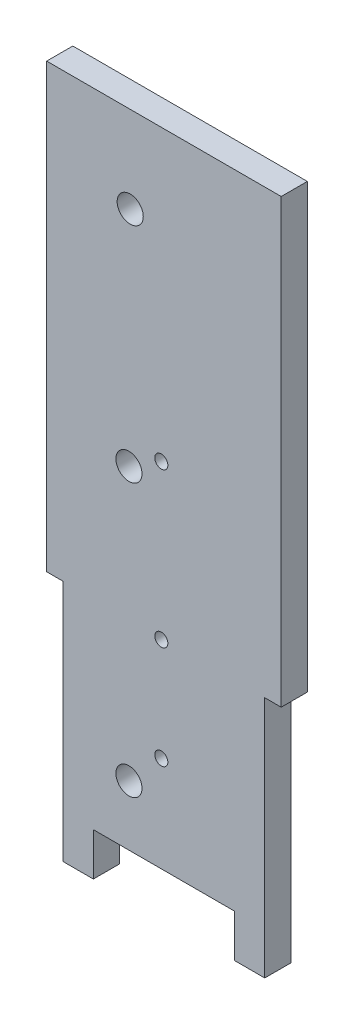
ISO-10303-21;
HEADER;
FILE_DESCRIPTION(('STEP AP214'),'2;1');
FILE_NAME('part.step','',(''),(''),'','','');
FILE_SCHEMA(('AUTOMOTIVE_DESIGN { 1 0 10303 214 1 1 1 1 }'));
ENDSEC;
DATA;
#1=APPLICATION_CONTEXT('core data for automotive mechanical design processes');
#2=APPLICATION_PROTOCOL_DEFINITION('international standard','automotive_design',2000,#1);
#3=PRODUCT_CONTEXT('',#1,'mechanical');
#4=PRODUCT('Part','Part','',(#3));
#5=PRODUCT_RELATED_PRODUCT_CATEGORY('part','',(#4));
#6=PRODUCT_DEFINITION_FORMATION('','',#4);
#7=PRODUCT_DEFINITION_CONTEXT('part definition',#1,'design');
#8=PRODUCT_DEFINITION('design','',#6,#7);
#9=PRODUCT_DEFINITION_SHAPE('','',#8);
#10=(LENGTH_UNIT() NAMED_UNIT(*) SI_UNIT(.MILLI.,.METRE.));
#11=(NAMED_UNIT(*) PLANE_ANGLE_UNIT() SI_UNIT($,.RADIAN.));
#12=(NAMED_UNIT(*) SI_UNIT($,.STERADIAN.) SOLID_ANGLE_UNIT());
#13=UNCERTAINTY_MEASURE_WITH_UNIT(LENGTH_MEASURE(1.E-05),#10,'distance_accuracy_value','');
#14=(GEOMETRIC_REPRESENTATION_CONTEXT(3) GLOBAL_UNCERTAINTY_ASSIGNED_CONTEXT((#13)) GLOBAL_UNIT_ASSIGNED_CONTEXT((#10,
#11,#12)) REPRESENTATION_CONTEXT('',''));
#15=CARTESIAN_POINT('',(0.,0.,0.));
#16=DIRECTION('',(0.,0.,1.));
#17=DIRECTION('',(1.,0.,0.));
#18=AXIS2_PLACEMENT_3D('',#15,#16,#17);
#19=CARTESIAN_POINT('',(-245.,0.,63.5));
#20=DIRECTION('',(0.,1.,0.));
#21=DIRECTION('',(0.,0.,1.));
#22=AXIS2_PLACEMENT_3D('',#19,#20,#21);
#23=PLANE('',#22);
#24=DIRECTION('',(1.,0.,0.));
#25=VECTOR('',#24,1.);
#26=CARTESIAN_POINT('',(-245.,0.,63.5));
#27=LINE('',#26,#25);
#28=CARTESIAN_POINT('',(171.5,0.,63.5));
#29=VERTEX_POINT('',#28);
#30=CARTESIAN_POINT('',(245.,0.,63.5));
#31=VERTEX_POINT('',#30);
#32=EDGE_CURVE('E199',#29,#31,#27,.T.);
#33=ORIENTED_EDGE('',*,*,#32,.F.);
#34=DIRECTION('',(0.,0.,-1.));
#35=VECTOR('',#34,1.);
#36=CARTESIAN_POINT('',(171.5,0.,63.5));
#37=LINE('',#36,#35);
#38=CARTESIAN_POINT('',(171.5,0.,0.));
#39=VERTEX_POINT('',#38);
#40=EDGE_CURVE('E201',#29,#39,#37,.T.);
#41=ORIENTED_EDGE('',*,*,#40,.T.);
#42=DIRECTION('',(1.,0.,0.));
#43=VECTOR('',#42,1.);
#44=CARTESIAN_POINT('',(-245.,0.,0.));
#45=LINE('',#44,#43);
#46=CARTESIAN_POINT('',(245.,0.,0.));
#47=VERTEX_POINT('',#46);
#48=EDGE_CURVE('E147',#39,#47,#45,.T.);
#49=ORIENTED_EDGE('',*,*,#48,.T.);
#50=DIRECTION('',(0.,0.,-1.));
#51=VECTOR('',#50,1.);
#52=CARTESIAN_POINT('',(245.,0.,63.5));
#53=LINE('',#52,#51);
#54=EDGE_CURVE('E42',#31,#47,#53,.T.);
#55=ORIENTED_EDGE('',*,*,#54,.F.);
#56=EDGE_LOOP('',(#33,#41,#49,#55));
#57=FACE_BOUND('',#56,.T.);
#58=ADVANCED_FACE('F34',(#57),#23,.F.);
#59=CARTESIAN_POINT('',(-245.,0.,63.5));
#60=DIRECTION('',(1.,0.,0.));
#61=DIRECTION('',(0.,0.,-1.));
#62=AXIS2_PLACEMENT_3D('',#59,#60,#61);
#63=PLANE('',#62);
#64=DIRECTION('',(0.,-1.,0.));
#65=VECTOR('',#64,1.);
#66=CARTESIAN_POINT('',(-245.,0.,0.));
#67=LINE('',#66,#65);
#68=CARTESIAN_POINT('',(-245.,590.,0.));
#69=VERTEX_POINT('',#68);
#70=CARTESIAN_POINT('',(-245.,0.,0.));
#71=VERTEX_POINT('',#70);
#72=EDGE_CURVE('E144',#69,#71,#67,.T.);
#73=ORIENTED_EDGE('',*,*,#72,.T.);
#74=DIRECTION('',(0.,0.,-1.));
#75=VECTOR('',#74,1.);
#76=CARTESIAN_POINT('',(-245.,0.,63.5));
#77=LINE('',#76,#75);
#78=CARTESIAN_POINT('',(-245.,0.,63.5));
#79=VERTEX_POINT('',#78);
#80=EDGE_CURVE('E11',#79,#71,#77,.T.);
#81=ORIENTED_EDGE('',*,*,#80,.F.);
#82=DIRECTION('',(0.,-1.,0.));
#83=VECTOR('',#82,1.);
#84=CARTESIAN_POINT('',(-245.,0.,63.5));
#85=LINE('',#84,#83);
#86=CARTESIAN_POINT('',(-245.,590.,63.5));
#87=VERTEX_POINT('',#86);
#88=EDGE_CURVE('E162',#87,#79,#85,.T.);
#89=ORIENTED_EDGE('',*,*,#88,.F.);
#90=DIRECTION('',(0.,0.,-1.));
#91=VECTOR('',#90,1.);
#92=CARTESIAN_POINT('',(-245.,590.,63.5));
#93=LINE('',#92,#91);
#94=EDGE_CURVE('E140',#87,#69,#93,.T.);
#95=ORIENTED_EDGE('',*,*,#94,.T.);
#96=EDGE_LOOP('',(#73,#81,#89,#95));
#97=FACE_BOUND('',#96,.T.);
#98=ADVANCED_FACE('F36',(#97),#63,.F.);
#99=CARTESIAN_POINT('',(-171.5,0.,0.));
#100=VERTEX_POINT('',#99);
#101=EDGE_CURVE('E149',#71,#100,#45,.T.);
#102=ORIENTED_EDGE('',*,*,#101,.T.);
#103=DIRECTION('',(0.,0.,-1.));
#104=VECTOR('',#103,1.);
#105=CARTESIAN_POINT('',(-171.5,0.,63.5));
#106=LINE('',#105,#104);
#107=CARTESIAN_POINT('',(-171.5,0.,63.5));
#108=VERTEX_POINT('',#107);
#109=EDGE_CURVE('E49',#108,#100,#106,.T.);
#110=ORIENTED_EDGE('',*,*,#109,.F.);
#111=EDGE_CURVE('E98',#79,#108,#27,.T.);
#112=ORIENTED_EDGE('',*,*,#111,.F.);
#113=ORIENTED_EDGE('',*,*,#80,.T.);
#114=EDGE_LOOP('',(#102,#110,#112,#113));
#115=FACE_BOUND('',#114,.T.);
#116=ADVANCED_FACE('F304',(#115),#23,.F.);
#117=CARTESIAN_POINT('',(245.,0.,63.5));
#118=DIRECTION('',(-1.,0.,0.));
#119=DIRECTION('',(0.,0.,1.));
#120=AXIS2_PLACEMENT_3D('',#117,#118,#119);
#121=PLANE('',#120);
#122=DIRECTION('',(0.,1.,0.));
#123=VECTOR('',#122,1.);
#124=CARTESIAN_POINT('',(245.,0.,0.));
#125=LINE('',#124,#123);
#126=CARTESIAN_POINT('',(245.,590.,0.));
#127=VERTEX_POINT('',#126);
#128=EDGE_CURVE('E152',#47,#127,#125,.T.);
#129=ORIENTED_EDGE('',*,*,#128,.T.);
#130=DIRECTION('',(0.,0.,-1.));
#131=VECTOR('',#130,1.);
#132=CARTESIAN_POINT('',(245.,590.,63.5));
#133=LINE('',#132,#131);
#134=CARTESIAN_POINT('',(245.,590.,63.5));
#135=VERTEX_POINT('',#134);
#136=EDGE_CURVE('E169',#135,#127,#133,.T.);
#137=ORIENTED_EDGE('',*,*,#136,.F.);
#138=DIRECTION('',(0.,1.,0.));
#139=VECTOR('',#138,1.);
#140=CARTESIAN_POINT('',(245.,0.,63.5));
#141=LINE('',#140,#139);
#142=EDGE_CURVE('E178',#31,#135,#141,.T.);
#143=ORIENTED_EDGE('',*,*,#142,.F.);
#144=ORIENTED_EDGE('',*,*,#54,.T.);
#145=EDGE_LOOP('',(#129,#137,#143,#144));
#146=FACE_BOUND('',#145,.T.);
#147=ADVANCED_FACE('F176',(#146),#121,.F.);
#148=CARTESIAN_POINT('',(245.,590.,63.5));
#149=DIRECTION('',(0.,1.,0.));
#150=DIRECTION('',(0.,0.,1.));
#151=AXIS2_PLACEMENT_3D('',#148,#149,#150);
#152=PLANE('',#151);
#153=DIRECTION('',(1.,0.,0.));
#154=VECTOR('',#153,1.);
#155=CARTESIAN_POINT('',(245.,590.,0.));
#156=LINE('',#155,#154);
#157=CARTESIAN_POINT('',(285.,590.,0.));
#158=VERTEX_POINT('',#157);
#159=EDGE_CURVE('E154',#127,#158,#156,.T.);
#160=ORIENTED_EDGE('',*,*,#159,.T.);
#161=DIRECTION('',(0.,0.,-1.));
#162=VECTOR('',#161,1.);
#163=CARTESIAN_POINT('',(285.,590.,63.5));
#164=LINE('',#163,#162);
#165=CARTESIAN_POINT('',(285.,590.,63.5));
#166=VERTEX_POINT('',#165);
#167=EDGE_CURVE('E166',#166,#158,#164,.T.);
#168=ORIENTED_EDGE('',*,*,#167,.F.);
#169=DIRECTION('',(1.,0.,0.));
#170=VECTOR('',#169,1.);
#171=CARTESIAN_POINT('',(245.,590.,63.5));
#172=LINE('',#171,#170);
#173=EDGE_CURVE('E194',#135,#166,#172,.T.);
#174=ORIENTED_EDGE('',*,*,#173,.F.);
#175=ORIENTED_EDGE('',*,*,#136,.T.);
#176=EDGE_LOOP('',(#160,#168,#174,#175));
#177=FACE_BOUND('',#176,.T.);
#178=ADVANCED_FACE('F190',(#177),#152,.F.);
#179=CARTESIAN_POINT('',(285.,1665.,63.5));
#180=DIRECTION('',(-1.,0.,0.));
#181=DIRECTION('',(0.,-1.,0.));
#182=AXIS2_PLACEMENT_3D('',#179,#180,#181);
#183=PLANE('',#182);
#184=DIRECTION('',(0.,1.,0.));
#185=VECTOR('',#184,1.);
#186=CARTESIAN_POINT('',(285.,1665.,0.));
#187=LINE('',#186,#185);
#188=CARTESIAN_POINT('',(285.,1665.,0.));
#189=VERTEX_POINT('',#188);
#190=EDGE_CURVE('E156',#158,#189,#187,.T.);
#191=ORIENTED_EDGE('',*,*,#190,.T.);
#192=DIRECTION('',(0.,0.,-1.));
#193=VECTOR('',#192,1.);
#194=CARTESIAN_POINT('',(285.,1665.,63.5));
#195=LINE('',#194,#193);
#196=CARTESIAN_POINT('',(285.,1665.,63.5));
#197=VERTEX_POINT('',#196);
#198=EDGE_CURVE('E135',#197,#189,#195,.T.);
#199=ORIENTED_EDGE('',*,*,#198,.F.);
#200=DIRECTION('',(0.,1.,0.));
#201=VECTOR('',#200,1.);
#202=CARTESIAN_POINT('',(285.,1665.,63.5));
#203=LINE('',#202,#201);
#204=EDGE_CURVE('E123',#166,#197,#203,.T.);
#205=ORIENTED_EDGE('',*,*,#204,.F.);
#206=ORIENTED_EDGE('',*,*,#167,.T.);
#207=EDGE_LOOP('',(#191,#199,#205,#206));
#208=FACE_BOUND('',#207,.T.);
#209=ADVANCED_FACE('F193',(#208),#183,.F.);
#210=CARTESIAN_POINT('',(-285.,1665.,63.5));
#211=DIRECTION('',(0.,-1.,0.));
#212=DIRECTION('',(0.,0.,-1.));
#213=AXIS2_PLACEMENT_3D('',#210,#211,#212);
#214=PLANE('',#213);
#215=DIRECTION('',(-1.,0.,0.));
#216=VECTOR('',#215,1.);
#217=CARTESIAN_POINT('',(-285.,1665.,0.));
#218=LINE('',#217,#216);
#219=CARTESIAN_POINT('',(-285.,1665.,0.));
#220=VERTEX_POINT('',#219);
#221=EDGE_CURVE('E132',#189,#220,#218,.T.);
#222=ORIENTED_EDGE('',*,*,#221,.T.);
#223=DIRECTION('',(0.,0.,-1.));
#224=VECTOR('',#223,1.);
#225=CARTESIAN_POINT('',(-285.,1665.,63.5));
#226=LINE('',#225,#224);
#227=CARTESIAN_POINT('',(-285.,1665.,63.5));
#228=VERTEX_POINT('',#227);
#229=EDGE_CURVE('E129',#228,#220,#226,.T.);
#230=ORIENTED_EDGE('',*,*,#229,.F.);
#231=DIRECTION('',(-1.,0.,0.));
#232=VECTOR('',#231,1.);
#233=CARTESIAN_POINT('',(-285.,1665.,63.5));
#234=LINE('',#233,#232);
#235=EDGE_CURVE('E115',#197,#228,#234,.T.);
#236=ORIENTED_EDGE('',*,*,#235,.F.);
#237=ORIENTED_EDGE('',*,*,#198,.T.);
#238=EDGE_LOOP('',(#222,#230,#236,#237));
#239=FACE_BOUND('',#238,.T.);
#240=ADVANCED_FACE('F130',(#239),#214,.F.);
#241=CARTESIAN_POINT('',(-285.,1665.,63.5));
#242=DIRECTION('',(1.,0.,0.));
#243=DIRECTION('',(0.,1.,0.));
#244=AXIS2_PLACEMENT_3D('',#241,#242,#243);
#245=PLANE('',#244);
#246=DIRECTION('',(0.,-1.,0.));
#247=VECTOR('',#246,1.);
#248=CARTESIAN_POINT('',(-285.,1665.,0.));
#249=LINE('',#248,#247);
#250=CARTESIAN_POINT('',(-285.,590.,0.));
#251=VERTEX_POINT('',#250);
#252=EDGE_CURVE('E159',#220,#251,#249,.T.);
#253=ORIENTED_EDGE('',*,*,#252,.T.);
#254=DIRECTION('',(0.,0.,-1.));
#255=VECTOR('',#254,1.);
#256=CARTESIAN_POINT('',(-285.,590.,63.5));
#257=LINE('',#256,#255);
#258=CARTESIAN_POINT('',(-285.,590.,63.5));
#259=VERTEX_POINT('',#258);
#260=EDGE_CURVE('E136',#259,#251,#257,.T.);
#261=ORIENTED_EDGE('',*,*,#260,.F.);
#262=DIRECTION('',(0.,-1.,0.));
#263=VECTOR('',#262,1.);
#264=CARTESIAN_POINT('',(-285.,1665.,63.5));
#265=LINE('',#264,#263);
#266=EDGE_CURVE('E120',#228,#259,#265,.T.);
#267=ORIENTED_EDGE('',*,*,#266,.F.);
#268=ORIENTED_EDGE('',*,*,#229,.T.);
#269=EDGE_LOOP('',(#253,#261,#267,#268));
#270=FACE_BOUND('',#269,.T.);
#271=ADVANCED_FACE('F138',(#270),#245,.F.);
#272=CARTESIAN_POINT('',(-245.,590.,63.5));
#273=DIRECTION('',(0.,1.,0.));
#274=DIRECTION('',(0.,0.,1.));
#275=AXIS2_PLACEMENT_3D('',#272,#273,#274);
#276=PLANE('',#275);
#277=DIRECTION('',(1.,0.,0.));
#278=VECTOR('',#277,1.);
#279=CARTESIAN_POINT('',(-245.,590.,0.));
#280=LINE('',#279,#278);
#281=EDGE_CURVE('E91',#251,#69,#280,.T.);
#282=ORIENTED_EDGE('',*,*,#281,.T.);
#283=ORIENTED_EDGE('',*,*,#94,.F.);
#284=DIRECTION('',(1.,0.,0.));
#285=VECTOR('',#284,1.);
#286=CARTESIAN_POINT('',(-245.,590.,63.5));
#287=LINE('',#286,#285);
#288=EDGE_CURVE('E58',#259,#87,#287,.T.);
#289=ORIENTED_EDGE('',*,*,#288,.F.);
#290=ORIENTED_EDGE('',*,*,#260,.T.);
#291=EDGE_LOOP('',(#282,#283,#289,#290));
#292=FACE_BOUND('',#291,.T.);
#293=ADVANCED_FACE('F274',(#292),#276,.F.);
#294=CARTESIAN_POINT('',(0.,0.,63.5));
#295=DIRECTION('',(0.,0.,1.));
#296=DIRECTION('',(1.,0.,0.));
#297=AXIS2_PLACEMENT_3D('',#294,#295,#296);
#298=PLANE('',#297);
#299=CARTESIAN_POINT('',(-6.40000000000003,586.5,63.5));
#300=DIRECTION('',(0.,0.,1.));
#301=DIRECTION('',(1.,0.,0.));
#302=AXIS2_PLACEMENT_3D('',#299,#300,#301);
#303=CIRCLE('',#302,15.875);
#304=CARTESIAN_POINT('',(9.47499999999996,586.5,63.5));
#305=VERTEX_POINT('',#304);
#306=EDGE_CURVE('E257',#305,#305,#303,.T.);
#307=ORIENTED_EDGE('',*,*,#306,.F.);
#308=EDGE_LOOP('',(#307));
#309=FACE_BOUND('',#308,.T.);
#310=CARTESIAN_POINT('',(-6.40000000000008,961.5,63.5));
#311=DIRECTION('',(0.,0.,1.));
#312=DIRECTION('',(1.,0.,0.));
#313=AXIS2_PLACEMENT_3D('',#310,#311,#312);
#314=CIRCLE('',#313,15.8750000000002);
#315=CARTESIAN_POINT('',(9.47500000000008,961.5,63.5));
#316=VERTEX_POINT('',#315);
#317=EDGE_CURVE('E251',#316,#316,#314,.T.);
#318=ORIENTED_EDGE('',*,*,#317,.F.);
#319=EDGE_LOOP('',(#318));
#320=FACE_BOUND('',#319,.T.);
#321=CARTESIAN_POINT('',(-6.39999999999999,336.5,63.5));
#322=DIRECTION('',(0.,0.,1.));
#323=DIRECTION('',(1.,0.,0.));
#324=AXIS2_PLACEMENT_3D('',#321,#322,#323);
#325=CIRCLE('',#324,15.875);
#326=CARTESIAN_POINT('',(9.475,336.5,63.5));
#327=VERTEX_POINT('',#326);
#328=EDGE_CURVE('E245',#327,#327,#325,.T.);
#329=ORIENTED_EDGE('',*,*,#328,.F.);
#330=EDGE_LOOP('',(#329));
#331=FACE_BOUND('',#330,.T.);
#332=CARTESIAN_POINT('',(-85.0000000000001,911.9875,63.5));
#333=DIRECTION('',(0.,0.,1.));
#334=DIRECTION('',(1.,0.,0.));
#335=AXIS2_PLACEMENT_3D('',#332,#333,#334);
#336=CIRCLE('',#335,31.75);
#337=CARTESIAN_POINT('',(-53.2500000000001,911.9875,63.5));
#338=VERTEX_POINT('',#337);
#339=EDGE_CURVE('E239',#338,#338,#336,.T.);
#340=ORIENTED_EDGE('',*,*,#339,.F.);
#341=EDGE_LOOP('',(#340));
#342=FACE_BOUND('',#341,.T.);
#343=CARTESIAN_POINT('',(-85.,250.,63.5));
#344=DIRECTION('',(0.,0.,1.));
#345=DIRECTION('',(1.,0.,0.));
#346=AXIS2_PLACEMENT_3D('',#343,#344,#345);
#347=CIRCLE('',#346,31.75);
#348=CARTESIAN_POINT('',(-53.25,250.,63.5));
#349=VERTEX_POINT('',#348);
#350=EDGE_CURVE('E233',#349,#349,#347,.T.);
#351=ORIENTED_EDGE('',*,*,#350,.F.);
#352=EDGE_LOOP('',(#351));
#353=FACE_BOUND('',#352,.T.);
#354=CARTESIAN_POINT('',(-81.9999999999999,1455.,63.5));
#355=DIRECTION('',(0.,0.,1.));
#356=DIRECTION('',(1.,0.,0.));
#357=AXIS2_PLACEMENT_3D('',#354,#355,#356);
#358=CIRCLE('',#357,31.75);
#359=CARTESIAN_POINT('',(-50.2499999999999,1455.,63.5));
#360=VERTEX_POINT('',#359);
#361=EDGE_CURVE('E227',#360,#360,#358,.T.);
#362=ORIENTED_EDGE('',*,*,#361,.F.);
#363=EDGE_LOOP('',(#362));
#364=FACE_BOUND('',#363,.T.);
#365=DIRECTION('',(0.,-1.,0.));
#366=VECTOR('',#365,1.);
#367=CARTESIAN_POINT('',(171.5,0.,63.5));
#368=LINE('',#367,#366);
#369=CARTESIAN_POINT('',(171.5,104.,63.5));
#370=VERTEX_POINT('',#369);
#371=EDGE_CURVE('E214',#370,#29,#368,.T.);
#372=ORIENTED_EDGE('',*,*,#371,.T.);
#373=ORIENTED_EDGE('',*,*,#32,.T.);
#374=ORIENTED_EDGE('',*,*,#142,.T.);
#375=ORIENTED_EDGE('',*,*,#173,.T.);
#376=ORIENTED_EDGE('',*,*,#204,.T.);
#377=ORIENTED_EDGE('',*,*,#235,.T.);
#378=ORIENTED_EDGE('',*,*,#266,.T.);
#379=ORIENTED_EDGE('',*,*,#288,.T.);
#380=ORIENTED_EDGE('',*,*,#88,.T.);
#381=ORIENTED_EDGE('',*,*,#111,.T.);
#382=DIRECTION('',(0.,1.,0.));
#383=VECTOR('',#382,1.);
#384=CARTESIAN_POINT('',(-171.5,0.,63.5));
#385=LINE('',#384,#383);
#386=CARTESIAN_POINT('',(-171.5,104.,63.5));
#387=VERTEX_POINT('',#386);
#388=EDGE_CURVE('E223',#108,#387,#385,.T.);
#389=ORIENTED_EDGE('',*,*,#388,.T.);
#390=DIRECTION('',(1.,0.,0.));
#391=VECTOR('',#390,1.);
#392=CARTESIAN_POINT('',(171.5,104.,63.5));
#393=LINE('',#392,#391);
#394=EDGE_CURVE('E204',#387,#370,#393,.T.);
#395=ORIENTED_EDGE('',*,*,#394,.T.);
#396=EDGE_LOOP('',(#372,#373,#374,#375,#376,#377,#378,#379,#380,#381,#389,#395));
#397=FACE_BOUND('',#396,.T.);
#398=ADVANCED_FACE('F118',(#309,#320,#331,#342,#353,#364,#397),#298,.T.);
#399=CARTESIAN_POINT('',(0.,0.,0.));
#400=DIRECTION('',(0.,0.,1.));
#401=DIRECTION('',(1.,0.,0.));
#402=AXIS2_PLACEMENT_3D('',#399,#400,#401);
#403=PLANE('',#402);
#404=CARTESIAN_POINT('',(-6.40000000000003,586.5,0.));
#405=DIRECTION('',(0.,0.,1.));
#406=DIRECTION('',(1.,0.,0.));
#407=AXIS2_PLACEMENT_3D('',#404,#405,#406);
#408=CIRCLE('',#407,15.875);
#409=CARTESIAN_POINT('',(9.47499999999996,586.5,0.));
#410=VERTEX_POINT('',#409);
#411=EDGE_CURVE('E248',#410,#410,#408,.T.);
#412=ORIENTED_EDGE('',*,*,#411,.T.);
#413=EDGE_LOOP('',(#412));
#414=FACE_BOUND('',#413,.T.);
#415=CARTESIAN_POINT('',(-6.40000000000008,961.5,0.));
#416=DIRECTION('',(0.,0.,1.));
#417=DIRECTION('',(1.,0.,0.));
#418=AXIS2_PLACEMENT_3D('',#415,#416,#417);
#419=CIRCLE('',#418,15.8750000000002);
#420=CARTESIAN_POINT('',(9.47500000000008,961.5,0.));
#421=VERTEX_POINT('',#420);
#422=EDGE_CURVE('E254',#421,#421,#419,.T.);
#423=ORIENTED_EDGE('',*,*,#422,.T.);
#424=EDGE_LOOP('',(#423));
#425=FACE_BOUND('',#424,.T.);
#426=CARTESIAN_POINT('',(-6.39999999999999,336.5,0.));
#427=DIRECTION('',(0.,0.,1.));
#428=DIRECTION('',(1.,0.,0.));
#429=AXIS2_PLACEMENT_3D('',#426,#427,#428);
#430=CIRCLE('',#429,15.875);
#431=CARTESIAN_POINT('',(9.475,336.5,0.));
#432=VERTEX_POINT('',#431);
#433=EDGE_CURVE('E242',#432,#432,#430,.T.);
#434=ORIENTED_EDGE('',*,*,#433,.T.);
#435=EDGE_LOOP('',(#434));
#436=FACE_BOUND('',#435,.T.);
#437=CARTESIAN_POINT('',(-85.0000000000001,911.9875,0.));
#438=DIRECTION('',(0.,0.,1.));
#439=DIRECTION('',(1.,0.,0.));
#440=AXIS2_PLACEMENT_3D('',#437,#438,#439);
#441=CIRCLE('',#440,31.75);
#442=CARTESIAN_POINT('',(-53.2500000000001,911.9875,0.));
#443=VERTEX_POINT('',#442);
#444=EDGE_CURVE('E236',#443,#443,#441,.T.);
#445=ORIENTED_EDGE('',*,*,#444,.T.);
#446=EDGE_LOOP('',(#445));
#447=FACE_BOUND('',#446,.T.);
#448=CARTESIAN_POINT('',(-85.,250.,0.));
#449=DIRECTION('',(0.,0.,1.));
#450=DIRECTION('',(1.,0.,0.));
#451=AXIS2_PLACEMENT_3D('',#448,#449,#450);
#452=CIRCLE('',#451,31.75);
#453=CARTESIAN_POINT('',(-53.25,250.,0.));
#454=VERTEX_POINT('',#453);
#455=EDGE_CURVE('E230',#454,#454,#452,.T.);
#456=ORIENTED_EDGE('',*,*,#455,.T.);
#457=EDGE_LOOP('',(#456));
#458=FACE_BOUND('',#457,.T.);
#459=CARTESIAN_POINT('',(-81.9999999999999,1455.,0.));
#460=DIRECTION('',(0.,0.,1.));
#461=DIRECTION('',(1.,0.,0.));
#462=AXIS2_PLACEMENT_3D('',#459,#460,#461);
#463=CIRCLE('',#462,31.75);
#464=CARTESIAN_POINT('',(-50.2499999999999,1455.,0.));
#465=VERTEX_POINT('',#464);
#466=EDGE_CURVE('E220',#465,#465,#463,.T.);
#467=ORIENTED_EDGE('',*,*,#466,.T.);
#468=EDGE_LOOP('',(#467));
#469=FACE_BOUND('',#468,.T.);
#470=ORIENTED_EDGE('',*,*,#48,.F.);
#471=DIRECTION('',(0.,-1.,0.));
#472=VECTOR('',#471,1.);
#473=CARTESIAN_POINT('',(171.5,0.,0.));
#474=LINE('',#473,#472);
#475=CARTESIAN_POINT('',(171.5,104.,0.));
#476=VERTEX_POINT('',#475);
#477=EDGE_CURVE('E217',#476,#39,#474,.T.);
#478=ORIENTED_EDGE('',*,*,#477,.F.);
#479=DIRECTION('',(1.,0.,0.));
#480=VECTOR('',#479,1.);
#481=CARTESIAN_POINT('',(171.5,104.,0.));
#482=LINE('',#481,#480);
#483=CARTESIAN_POINT('',(-171.5,104.,0.));
#484=VERTEX_POINT('',#483);
#485=EDGE_CURVE('E211',#484,#476,#482,.T.);
#486=ORIENTED_EDGE('',*,*,#485,.F.);
#487=DIRECTION('',(0.,1.,0.));
#488=VECTOR('',#487,1.);
#489=CARTESIAN_POINT('',(-171.5,0.,0.));
#490=LINE('',#489,#488);
#491=EDGE_CURVE('E215',#100,#484,#490,.T.);
#492=ORIENTED_EDGE('',*,*,#491,.F.);
#493=ORIENTED_EDGE('',*,*,#101,.F.);
#494=ORIENTED_EDGE('',*,*,#72,.F.);
#495=ORIENTED_EDGE('',*,*,#281,.F.);
#496=ORIENTED_EDGE('',*,*,#252,.F.);
#497=ORIENTED_EDGE('',*,*,#221,.F.);
#498=ORIENTED_EDGE('',*,*,#190,.F.);
#499=ORIENTED_EDGE('',*,*,#159,.F.);
#500=ORIENTED_EDGE('',*,*,#128,.F.);
#501=EDGE_LOOP('',(#470,#478,#486,#492,#493,#494,#495,#496,#497,#498,#499,#500));
#502=FACE_BOUND('',#501,.T.);
#503=ADVANCED_FACE('F184',(#414,#425,#436,#447,#458,#469,#502),#403,.F.);
#504=CARTESIAN_POINT('',(171.5,0.,63.5));
#505=DIRECTION('',(1.,0.,0.));
#506=DIRECTION('',(0.,0.,-1.));
#507=AXIS2_PLACEMENT_3D('',#504,#505,#506);
#508=PLANE('',#507);
#509=ORIENTED_EDGE('',*,*,#477,.T.);
#510=ORIENTED_EDGE('',*,*,#40,.F.);
#511=ORIENTED_EDGE('',*,*,#371,.F.);
#512=DIRECTION('',(0.,0.,-1.));
#513=VECTOR('',#512,1.);
#514=CARTESIAN_POINT('',(171.5,104.,63.5));
#515=LINE('',#514,#513);
#516=EDGE_CURVE('E148',#370,#476,#515,.T.);
#517=ORIENTED_EDGE('',*,*,#516,.T.);
#518=EDGE_LOOP('',(#509,#510,#511,#517));
#519=FACE_BOUND('',#518,.T.);
#520=ADVANCED_FACE('F333',(#519),#508,.F.);
#521=CARTESIAN_POINT('',(171.5,104.,63.5));
#522=DIRECTION('',(0.,1.,0.));
#523=DIRECTION('',(0.,0.,1.));
#524=AXIS2_PLACEMENT_3D('',#521,#522,#523);
#525=PLANE('',#524);
#526=ORIENTED_EDGE('',*,*,#485,.T.);
#527=ORIENTED_EDGE('',*,*,#516,.F.);
#528=ORIENTED_EDGE('',*,*,#394,.F.);
#529=DIRECTION('',(0.,0.,-1.));
#530=VECTOR('',#529,1.);
#531=CARTESIAN_POINT('',(-171.5,104.,63.5));
#532=LINE('',#531,#530);
#533=EDGE_CURVE('E206',#387,#484,#532,.T.);
#534=ORIENTED_EDGE('',*,*,#533,.T.);
#535=EDGE_LOOP('',(#526,#527,#528,#534));
#536=FACE_BOUND('',#535,.T.);
#537=ADVANCED_FACE('F299',(#536),#525,.F.);
#538=CARTESIAN_POINT('',(-171.5,0.,63.5));
#539=DIRECTION('',(-1.,0.,0.));
#540=DIRECTION('',(0.,0.,1.));
#541=AXIS2_PLACEMENT_3D('',#538,#539,#540);
#542=PLANE('',#541);
#543=ORIENTED_EDGE('',*,*,#491,.T.);
#544=ORIENTED_EDGE('',*,*,#533,.F.);
#545=ORIENTED_EDGE('',*,*,#388,.F.);
#546=ORIENTED_EDGE('',*,*,#109,.T.);
#547=EDGE_LOOP('',(#543,#544,#545,#546));
#548=FACE_BOUND('',#547,.T.);
#549=ADVANCED_FACE('F289',(#548),#542,.F.);
#550=CARTESIAN_POINT('',(-81.9999999999999,1455.,0.));
#551=DIRECTION('',(0.,0.,1.));
#552=DIRECTION('',(1.,0.,0.));
#553=AXIS2_PLACEMENT_3D('',#550,#551,#552);
#554=CYLINDRICAL_SURFACE('',#553,31.75);
#555=ORIENTED_EDGE('',*,*,#466,.F.);
#556=EDGE_LOOP('',(#555));
#557=FACE_BOUND('',#556,.T.);
#558=ORIENTED_EDGE('',*,*,#361,.T.);
#559=EDGE_LOOP('',(#558));
#560=FACE_BOUND('',#559,.T.);
#561=ADVANCED_FACE('F286',(#557,#560),#554,.F.);
#562=CARTESIAN_POINT('',(-85.,250.,0.));
#563=DIRECTION('',(0.,0.,1.));
#564=DIRECTION('',(1.,0.,0.));
#565=AXIS2_PLACEMENT_3D('',#562,#563,#564);
#566=CYLINDRICAL_SURFACE('',#565,31.75);
#567=ORIENTED_EDGE('',*,*,#455,.F.);
#568=EDGE_LOOP('',(#567));
#569=FACE_BOUND('',#568,.T.);
#570=ORIENTED_EDGE('',*,*,#350,.T.);
#571=EDGE_LOOP('',(#570));
#572=FACE_BOUND('',#571,.T.);
#573=ADVANCED_FACE('F288',(#569,#572),#566,.F.);
#574=CARTESIAN_POINT('',(-85.0000000000001,911.9875,0.));
#575=DIRECTION('',(0.,0.,1.));
#576=DIRECTION('',(1.,0.,0.));
#577=AXIS2_PLACEMENT_3D('',#574,#575,#576);
#578=CYLINDRICAL_SURFACE('',#577,31.75);
#579=ORIENTED_EDGE('',*,*,#444,.F.);
#580=EDGE_LOOP('',(#579));
#581=FACE_BOUND('',#580,.T.);
#582=ORIENTED_EDGE('',*,*,#339,.T.);
#583=EDGE_LOOP('',(#582));
#584=FACE_BOUND('',#583,.T.);
#585=ADVANCED_FACE('F296',(#581,#584),#578,.F.);
#586=CARTESIAN_POINT('',(-6.39999999999999,336.5,0.));
#587=DIRECTION('',(0.,0.,1.));
#588=DIRECTION('',(1.,0.,0.));
#589=AXIS2_PLACEMENT_3D('',#586,#587,#588);
#590=CYLINDRICAL_SURFACE('',#589,15.875);
#591=ORIENTED_EDGE('',*,*,#433,.F.);
#592=EDGE_LOOP('',(#591));
#593=FACE_BOUND('',#592,.T.);
#594=ORIENTED_EDGE('',*,*,#328,.T.);
#595=EDGE_LOOP('',(#594));
#596=FACE_BOUND('',#595,.T.);
#597=ADVANCED_FACE('F415',(#593,#596),#590,.F.);
#598=CARTESIAN_POINT('',(-6.40000000000008,961.5,0.));
#599=DIRECTION('',(0.,0.,1.));
#600=DIRECTION('',(1.,0.,0.));
#601=AXIS2_PLACEMENT_3D('',#598,#599,#600);
#602=CYLINDRICAL_SURFACE('',#601,15.8750000000002);
#603=ORIENTED_EDGE('',*,*,#422,.F.);
#604=EDGE_LOOP('',(#603));
#605=FACE_BOUND('',#604,.T.);
#606=ORIENTED_EDGE('',*,*,#317,.T.);
#607=EDGE_LOOP('',(#606));
#608=FACE_BOUND('',#607,.T.);
#609=ADVANCED_FACE('F268',(#605,#608),#602,.F.);
#610=CARTESIAN_POINT('',(-6.40000000000003,586.5,0.));
#611=DIRECTION('',(0.,0.,1.));
#612=DIRECTION('',(1.,0.,0.));
#613=AXIS2_PLACEMENT_3D('',#610,#611,#612);
#614=CYLINDRICAL_SURFACE('',#613,15.875);
#615=ORIENTED_EDGE('',*,*,#411,.F.);
#616=EDGE_LOOP('',(#615));
#617=FACE_BOUND('',#616,.T.);
#618=ORIENTED_EDGE('',*,*,#306,.T.);
#619=EDGE_LOOP('',(#618));
#620=FACE_BOUND('',#619,.T.);
#621=ADVANCED_FACE('F265',(#617,#620),#614,.F.);
#622=CLOSED_SHELL('',(#58,#98,#116,#147,#178,#209,#240,#271,#293,#398,#503,#520,#537,#549,#561,
#573,#585,#597,#609,#621));
#623=MANIFOLD_SOLID_BREP('B2',#622);
#624=ADVANCED_BREP_SHAPE_REPRESENTATION('',(#18,#623),#14);
#625=SHAPE_DEFINITION_REPRESENTATION(#9,#624);
ENDSEC;
END-ISO-10303-21;
